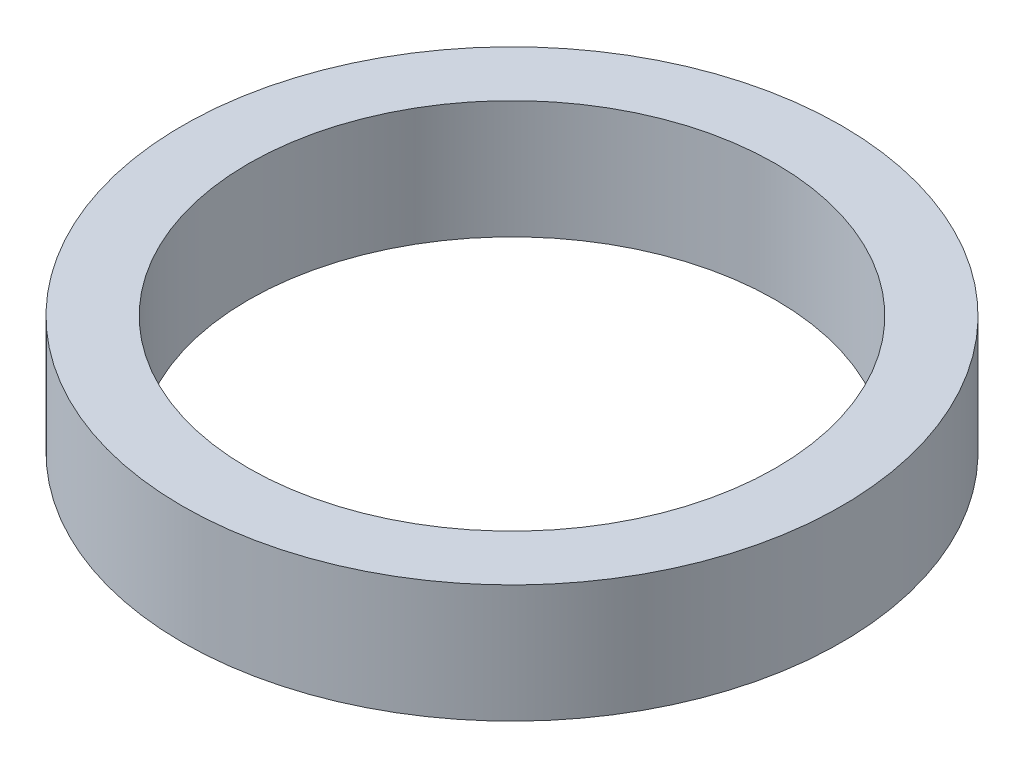
ISO-10303-21;
HEADER;
FILE_DESCRIPTION(('STEP AP214'),'2;1');
FILE_NAME('part.step','',(''),(''),'','','');
FILE_SCHEMA(('AUTOMOTIVE_DESIGN { 1 0 10303 214 1 1 1 1 }'));
ENDSEC;
DATA;
#1=APPLICATION_CONTEXT('core data for automotive mechanical design processes');
#2=APPLICATION_PROTOCOL_DEFINITION('international standard','automotive_design',2000,#1);
#3=PRODUCT_CONTEXT('',#1,'mechanical');
#4=PRODUCT('Part','Part','',(#3));
#5=PRODUCT_RELATED_PRODUCT_CATEGORY('part','',(#4));
#6=PRODUCT_DEFINITION_FORMATION('','',#4);
#7=PRODUCT_DEFINITION_CONTEXT('part definition',#1,'design');
#8=PRODUCT_DEFINITION('design','',#6,#7);
#9=PRODUCT_DEFINITION_SHAPE('','',#8);
#10=(LENGTH_UNIT() NAMED_UNIT(*) SI_UNIT(.MILLI.,.METRE.));
#11=(NAMED_UNIT(*) PLANE_ANGLE_UNIT() SI_UNIT($,.RADIAN.));
#12=(NAMED_UNIT(*) SI_UNIT($,.STERADIAN.) SOLID_ANGLE_UNIT());
#13=UNCERTAINTY_MEASURE_WITH_UNIT(LENGTH_MEASURE(1.E-05),#10,'distance_accuracy_value','');
#14=(GEOMETRIC_REPRESENTATION_CONTEXT(3) GLOBAL_UNCERTAINTY_ASSIGNED_CONTEXT((#13)) GLOBAL_UNIT_ASSIGNED_CONTEXT((#10,
#11,#12)) REPRESENTATION_CONTEXT('',''));
#15=CARTESIAN_POINT('',(0.,0.,0.));
#16=DIRECTION('',(0.,0.,1.));
#17=DIRECTION('',(1.,0.,0.));
#18=AXIS2_PLACEMENT_3D('',#15,#16,#17);
#19=CARTESIAN_POINT('',(0.,3.41,0.));
#20=DIRECTION('',(0.,-1.,0.));
#21=DIRECTION('',(0.,0.,-1.));
#22=AXIS2_PLACEMENT_3D('',#19,#20,#21);
#23=CYLINDRICAL_SURFACE('',#22,9.525);
#24=CARTESIAN_POINT('',(0.,3.41,0.));
#25=DIRECTION('',(0.,1.,0.));
#26=DIRECTION('',(0.,0.,1.));
#27=AXIS2_PLACEMENT_3D('',#24,#25,#26);
#28=CIRCLE('',#27,9.525);
#29=CARTESIAN_POINT('',(0.,3.41,9.525));
#30=VERTEX_POINT('',#29);
#31=EDGE_CURVE('E10',#30,#30,#28,.T.);
#32=ORIENTED_EDGE('',*,*,#31,.F.);
#33=EDGE_LOOP('',(#32));
#34=FACE_BOUND('',#33,.T.);
#35=CARTESIAN_POINT('',(0.,0.,0.));
#36=DIRECTION('',(0.,1.,0.));
#37=DIRECTION('',(0.,0.,1.));
#38=AXIS2_PLACEMENT_3D('',#35,#36,#37);
#39=CIRCLE('',#38,9.525);
#40=CARTESIAN_POINT('',(0.,0.,9.525));
#41=VERTEX_POINT('',#40);
#42=EDGE_CURVE('E33',#41,#41,#39,.T.);
#43=ORIENTED_EDGE('',*,*,#42,.T.);
#44=EDGE_LOOP('',(#43));
#45=FACE_BOUND('',#44,.T.);
#46=ADVANCED_FACE('F30',(#34,#45),#23,.T.);
#47=CARTESIAN_POINT('',(0.,3.41,0.));
#48=DIRECTION('',(0.,1.,0.));
#49=DIRECTION('',(0.,0.,1.));
#50=AXIS2_PLACEMENT_3D('',#47,#48,#49);
#51=PLANE('',#50);
#52=CARTESIAN_POINT('',(0.,3.41,0.));
#53=DIRECTION('',(0.,-1.,0.));
#54=DIRECTION('',(0.,0.,-1.));
#55=AXIS2_PLACEMENT_3D('',#52,#53,#54);
#56=CIRCLE('',#55,7.62);
#57=CARTESIAN_POINT('',(0.,3.41,-7.62));
#58=VERTEX_POINT('',#57);
#59=EDGE_CURVE('E40',#58,#58,#56,.T.);
#60=ORIENTED_EDGE('',*,*,#59,.T.);
#61=EDGE_LOOP('',(#60));
#62=FACE_BOUND('',#61,.T.);
#63=ORIENTED_EDGE('',*,*,#31,.T.);
#64=EDGE_LOOP('',(#63));
#65=FACE_BOUND('',#64,.T.);
#66=ADVANCED_FACE('F48',(#62,#65),#51,.T.);
#67=CARTESIAN_POINT('',(0.,0.,0.));
#68=DIRECTION('',(0.,1.,0.));
#69=DIRECTION('',(0.,0.,1.));
#70=AXIS2_PLACEMENT_3D('',#67,#68,#69);
#71=PLANE('',#70);
#72=CARTESIAN_POINT('',(0.,0.,0.));
#73=DIRECTION('',(0.,-1.,0.));
#74=DIRECTION('',(0.,0.,-1.));
#75=AXIS2_PLACEMENT_3D('',#72,#73,#74);
#76=CIRCLE('',#75,7.62);
#77=CARTESIAN_POINT('',(0.,0.,-7.62));
#78=VERTEX_POINT('',#77);
#79=EDGE_CURVE('E42',#78,#78,#76,.T.);
#80=ORIENTED_EDGE('',*,*,#79,.F.);
#81=EDGE_LOOP('',(#80));
#82=FACE_BOUND('',#81,.T.);
#83=ORIENTED_EDGE('',*,*,#42,.F.);
#84=EDGE_LOOP('',(#83));
#85=FACE_BOUND('',#84,.T.);
#86=ADVANCED_FACE('F53',(#82,#85),#71,.F.);
#87=CARTESIAN_POINT('',(0.,3.41,0.));
#88=DIRECTION('',(0.,-1.,0.));
#89=DIRECTION('',(0.,0.,-1.));
#90=AXIS2_PLACEMENT_3D('',#87,#88,#89);
#91=CYLINDRICAL_SURFACE('',#90,7.62);
#92=ORIENTED_EDGE('',*,*,#59,.F.);
#93=EDGE_LOOP('',(#92));
#94=FACE_BOUND('',#93,.T.);
#95=ORIENTED_EDGE('',*,*,#79,.T.);
#96=EDGE_LOOP('',(#95));
#97=FACE_BOUND('',#96,.T.);
#98=ADVANCED_FACE('F50',(#94,#97),#91,.F.);
#99=CLOSED_SHELL('',(#46,#66,#86,#98));
#100=MANIFOLD_SOLID_BREP('B2',#99);
#101=ADVANCED_BREP_SHAPE_REPRESENTATION('',(#18,#100),#14);
#102=SHAPE_DEFINITION_REPRESENTATION(#9,#101);
ENDSEC;
END-ISO-10303-21;
